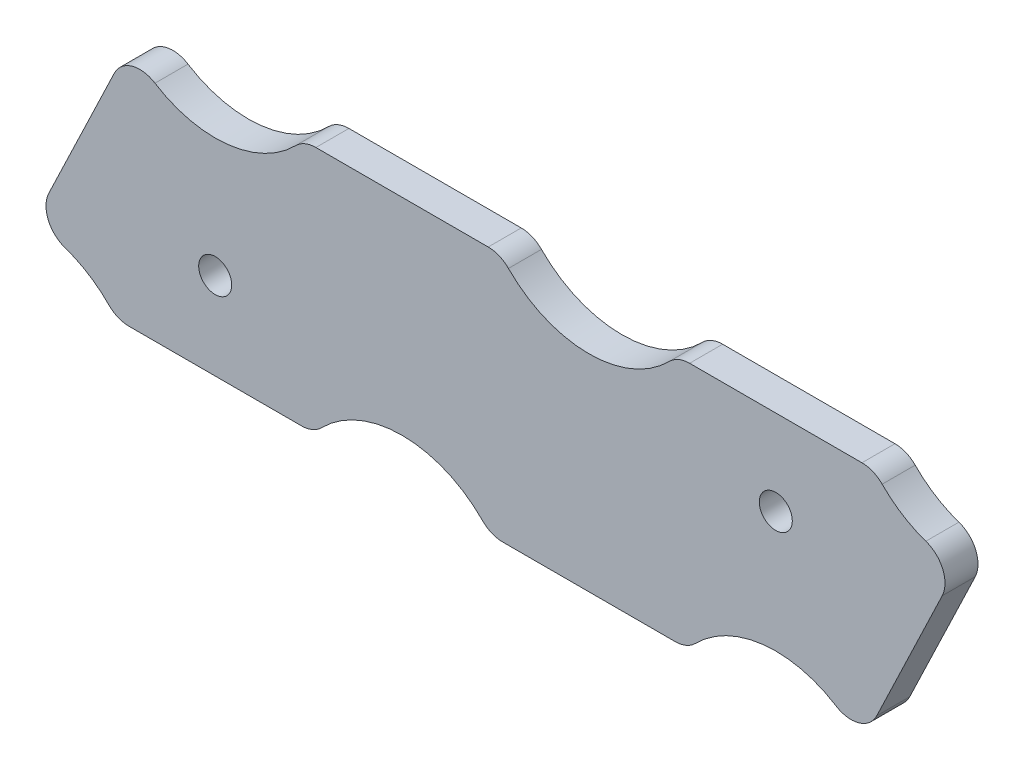
ISO-10303-21;
HEADER;
FILE_DESCRIPTION(('STEP AP214'),'2;1');
FILE_NAME('part.step','',(''),(''),'','','');
FILE_SCHEMA(('AUTOMOTIVE_DESIGN { 1 0 10303 214 1 1 1 1 }'));
ENDSEC;
DATA;
#1=APPLICATION_CONTEXT('core data for automotive mechanical design processes');
#2=APPLICATION_PROTOCOL_DEFINITION('international standard','automotive_design',2000,#1);
#3=PRODUCT_CONTEXT('',#1,'mechanical');
#4=PRODUCT('Part','Part','',(#3));
#5=PRODUCT_RELATED_PRODUCT_CATEGORY('part','',(#4));
#6=PRODUCT_DEFINITION_FORMATION('','',#4);
#7=PRODUCT_DEFINITION_CONTEXT('part definition',#1,'design');
#8=PRODUCT_DEFINITION('design','',#6,#7);
#9=PRODUCT_DEFINITION_SHAPE('','',#8);
#10=(LENGTH_UNIT() NAMED_UNIT(*) SI_UNIT(.MILLI.,.METRE.));
#11=(NAMED_UNIT(*) PLANE_ANGLE_UNIT() SI_UNIT($,.RADIAN.));
#12=(NAMED_UNIT(*) SI_UNIT($,.STERADIAN.) SOLID_ANGLE_UNIT());
#13=UNCERTAINTY_MEASURE_WITH_UNIT(LENGTH_MEASURE(1.E-05),#10,'distance_accuracy_value','');
#14=(GEOMETRIC_REPRESENTATION_CONTEXT(3) GLOBAL_UNCERTAINTY_ASSIGNED_CONTEXT((#13)) GLOBAL_UNIT_ASSIGNED_CONTEXT((#10,
#11,#12)) REPRESENTATION_CONTEXT('',''));
#15=CARTESIAN_POINT('',(0.,0.,0.));
#16=DIRECTION('',(0.,0.,1.));
#17=DIRECTION('',(1.,0.,0.));
#18=AXIS2_PLACEMENT_3D('',#15,#16,#17);
#19=CARTESIAN_POINT('',(0.,0.,2.032));
#20=DIRECTION('',(0.,0.,1.));
#21=DIRECTION('',(1.,0.,0.));
#22=AXIS2_PLACEMENT_3D('',#19,#20,#21);
#23=PLANE('',#22);
#24=CARTESIAN_POINT('',(56.775,25.1695790086618,2.032));
#25=DIRECTION('',(0.,0.,1.));
#26=DIRECTION('',(1.,0.,0.));
#27=AXIS2_PLACEMENT_3D('',#24,#25,#26);
#28=CIRCLE('',#27,1.016);
#29=CARTESIAN_POINT('',(57.7910000000001,25.1695790086618,2.032));
#30=VERTEX_POINT('',#29);
#31=EDGE_CURVE('E447',#30,#30,#28,.T.);
#32=ORIENTED_EDGE('',*,*,#31,.F.);
#33=EDGE_LOOP('',(#32));
#34=FACE_BOUND('',#33,.T.);
#35=CARTESIAN_POINT('',(22.275,20.4920677095079,2.032));
#36=DIRECTION('',(0.,0.,1.));
#37=DIRECTION('',(1.,0.,0.));
#38=AXIS2_PLACEMENT_3D('',#35,#36,#37);
#39=CIRCLE('',#38,1.016);
#40=CARTESIAN_POINT('',(23.291,20.4920677095079,2.032));
#41=VERTEX_POINT('',#40);
#42=EDGE_CURVE('E55',#41,#41,#39,.T.);
#43=ORIENTED_EDGE('',*,*,#42,.F.);
#44=EDGE_LOOP('',(#43));
#45=FACE_BOUND('',#44,.T.);
#46=CARTESIAN_POINT('',(22.275,34.775,2.032));
#47=DIRECTION('',(0.,0.,-1.));
#48=DIRECTION('',(1.,0.,0.));
#49=AXIS2_PLACEMENT_3D('',#46,#47,#48);
#50=CIRCLE('',#49,6.954);
#51=CARTESIAN_POINT('',(27.228374403337,29.8942010878991,2.032));
#52=VERTEX_POINT('',#51);
#53=CARTESIAN_POINT('',(18.5691218534122,28.8907342715813,2.032));
#54=VERTEX_POINT('',#53);
#55=EDGE_CURVE('E398',#52,#54,#50,.T.);
#56=ORIENTED_EDGE('',*,*,#55,.T.);
#57=CARTESIAN_POINT('',(17.6386554680308,27.4133215649636,2.032));
#58=DIRECTION('',(0.,0.,1.));
#59=DIRECTION('',(1.,0.,0.));
#60=AXIS2_PLACEMENT_3D('',#57,#58,#59);
#61=CIRCLE('',#60,1.746);
#62=CARTESIAN_POINT('',(16.0640846818776,28.1678033999954,2.032));
#63=VERTEX_POINT('',#62);
#64=EDGE_CURVE('E293',#54,#63,#61,.T.);
#65=ORIENTED_EDGE('',*,*,#64,.T.);
#66=DIRECTION('',(-0.432120180430553,-0.901816028724632,0.));
#67=VECTOR('',#66,1.);
#68=CARTESIAN_POINT('',(16.0640846818776,28.1678033999954,2.032));
#69=LINE('',#68,#67);
#70=CARTESIAN_POINT('',(12.0331416883667,19.7554006309292,2.032));
#71=VERTEX_POINT('',#70);
#72=EDGE_CURVE('E297',#63,#71,#69,.T.);
#73=ORIENTED_EDGE('',*,*,#72,.T.);
#74=CARTESIAN_POINT('',(13.6077124745199,19.0009187958975,2.032));
#75=DIRECTION('',(0.,0.,1.));
#76=DIRECTION('',(1.,0.,0.));
#77=AXIS2_PLACEMENT_3D('',#74,#75,#76);
#78=CIRCLE('',#77,1.746);
#79=CARTESIAN_POINT('',(13.0392163848059,17.3500619892725,2.032));
#80=VERTEX_POINT('',#79);
#81=EDGE_CURVE('E63',#71,#80,#78,.T.);
#82=ORIENTED_EDGE('',*,*,#81,.T.);
#83=CARTESIAN_POINT('',(10.775,10.775,2.032));
#84=DIRECTION('',(0.,0.,-1.));
#85=DIRECTION('',(1.,0.,0.));
#86=AXIS2_PLACEMENT_3D('',#83,#84,#85);
#87=CIRCLE('',#86,6.954);
#88=CARTESIAN_POINT('',(15.728374403337,15.6557989121009,2.032));
#89=VERTEX_POINT('',#88);
#90=EDGE_CURVE('E216',#80,#89,#87,.T.);
#91=ORIENTED_EDGE('',*,*,#90,.T.);
#92=CARTESIAN_POINT('',(16.9720602975312,16.8812626596603,2.032));
#93=DIRECTION('',(0.,0.,1.));
#94=DIRECTION('',(1.,0.,0.));
#95=AXIS2_PLACEMENT_3D('',#92,#93,#94);
#96=CIRCLE('',#95,1.746);
#97=CARTESIAN_POINT('',(16.9720602975312,15.1352626596603,2.032));
#98=VERTEX_POINT('',#97);
#99=EDGE_CURVE('E312',#89,#98,#96,.T.);
#100=ORIENTED_EDGE('',*,*,#99,.T.);
#101=DIRECTION('',(1.,0.,0.));
#102=VECTOR('',#101,1.);
#103=CARTESIAN_POINT('',(16.9720602975312,15.1352626596603,2.032));
#104=LINE('',#103,#102);
#105=CARTESIAN_POINT('',(27.5779397024688,15.1352626596603,2.032));
#106=VERTEX_POINT('',#105);
#107=EDGE_CURVE('E316',#98,#106,#104,.T.);
#108=ORIENTED_EDGE('',*,*,#107,.T.);
#109=CARTESIAN_POINT('',(27.5779397024688,16.8812626596603,2.032));
#110=DIRECTION('',(0.,0.,1.));
#111=DIRECTION('',(1.,0.,0.));
#112=AXIS2_PLACEMENT_3D('',#109,#110,#111);
#113=CIRCLE('',#112,1.746);
#114=CARTESIAN_POINT('',(28.821625596663,15.6557989121009,2.032));
#115=VERTEX_POINT('',#114);
#116=EDGE_CURVE('E324',#106,#115,#113,.T.);
#117=ORIENTED_EDGE('',*,*,#116,.T.);
#118=CARTESIAN_POINT('',(33.775,10.775,2.032));
#119=DIRECTION('',(0.,0.,-1.));
#120=DIRECTION('',(1.,0.,0.));
#121=AXIS2_PLACEMENT_3D('',#118,#119,#120);
#122=CIRCLE('',#121,6.954);
#123=CARTESIAN_POINT('',(38.728374403337,15.6557989121009,2.032));
#124=VERTEX_POINT('',#123);
#125=EDGE_CURVE('E327',#115,#124,#122,.T.);
#126=ORIENTED_EDGE('',*,*,#125,.T.);
#127=CARTESIAN_POINT('',(39.9720602975312,16.8812626596603,2.032));
#128=DIRECTION('',(0.,0.,1.));
#129=DIRECTION('',(1.,0.,0.));
#130=AXIS2_PLACEMENT_3D('',#127,#128,#129);
#131=CIRCLE('',#130,1.746);
#132=CARTESIAN_POINT('',(39.9720602975312,15.1352626596604,2.032));
#133=VERTEX_POINT('',#132);
#134=EDGE_CURVE('E331',#124,#133,#131,.T.);
#135=ORIENTED_EDGE('',*,*,#134,.T.);
#136=DIRECTION('',(1.,0.,0.));
#137=VECTOR('',#136,1.);
#138=CARTESIAN_POINT('',(39.9720602975312,15.1352626596604,2.032));
#139=LINE('',#138,#137);
#140=CARTESIAN_POINT('',(50.5779397024688,15.1352626596603,2.032));
#141=VERTEX_POINT('',#140);
#142=EDGE_CURVE('E335',#133,#141,#139,.T.);
#143=ORIENTED_EDGE('',*,*,#142,.T.);
#144=CARTESIAN_POINT('',(50.5779397024688,16.8812626596603,2.032));
#145=DIRECTION('',(0.,0.,1.));
#146=DIRECTION('',(1.,0.,0.));
#147=AXIS2_PLACEMENT_3D('',#144,#145,#146);
#148=CIRCLE('',#147,1.746);
#149=CARTESIAN_POINT('',(51.821625596663,15.6557989121009,2.032));
#150=VERTEX_POINT('',#149);
#151=EDGE_CURVE('E343',#141,#150,#148,.T.);
#152=ORIENTED_EDGE('',*,*,#151,.T.);
#153=CARTESIAN_POINT('',(56.775,10.775,2.032));
#154=DIRECTION('',(0.,0.,-1.));
#155=DIRECTION('',(1.,0.,0.));
#156=AXIS2_PLACEMENT_3D('',#153,#154,#155);
#157=CIRCLE('',#156,6.95400000000001);
#158=CARTESIAN_POINT('',(60.4808781465878,16.6592657284187,2.032));
#159=VERTEX_POINT('',#158);
#160=EDGE_CURVE('E346',#150,#159,#157,.T.);
#161=ORIENTED_EDGE('',*,*,#160,.T.);
#162=CARTESIAN_POINT('',(61.4113445319692,18.1366784350364,2.032));
#163=DIRECTION('',(0.,0.,1.));
#164=DIRECTION('',(1.,0.,0.));
#165=AXIS2_PLACEMENT_3D('',#162,#163,#164);
#166=CIRCLE('',#165,1.746);
#167=CARTESIAN_POINT('',(62.9859153181224,17.3821966000046,2.032));
#168=VERTEX_POINT('',#167);
#169=EDGE_CURVE('E350',#159,#168,#166,.T.);
#170=ORIENTED_EDGE('',*,*,#169,.T.);
#171=DIRECTION('',(0.432120180430553,0.901816028724632,0.));
#172=VECTOR('',#171,1.);
#173=CARTESIAN_POINT('',(62.9859153181224,17.3821966000046,2.032));
#174=LINE('',#173,#172);
#175=CARTESIAN_POINT('',(67.0168583116333,25.7945993690708,2.032));
#176=VERTEX_POINT('',#175);
#177=EDGE_CURVE('E354',#168,#176,#174,.T.);
#178=ORIENTED_EDGE('',*,*,#177,.T.);
#179=CARTESIAN_POINT('',(65.4422875254801,26.5490812041025,2.032));
#180=DIRECTION('',(0.,0.,1.));
#181=DIRECTION('',(1.,0.,0.));
#182=AXIS2_PLACEMENT_3D('',#179,#180,#181);
#183=CIRCLE('',#182,1.746);
#184=CARTESIAN_POINT('',(66.0107836151941,28.1999380107275,2.032));
#185=VERTEX_POINT('',#184);
#186=EDGE_CURVE('E362',#176,#185,#183,.T.);
#187=ORIENTED_EDGE('',*,*,#186,.T.);
#188=CARTESIAN_POINT('',(68.275,34.775,2.032));
#189=DIRECTION('',(0.,0.,-1.));
#190=DIRECTION('',(1.,0.,0.));
#191=AXIS2_PLACEMENT_3D('',#188,#189,#190);
#192=CIRCLE('',#191,6.95400000000001);
#193=CARTESIAN_POINT('',(63.3216255966629,29.8942010878991,2.032));
#194=VERTEX_POINT('',#193);
#195=EDGE_CURVE('E365',#185,#194,#192,.T.);
#196=ORIENTED_EDGE('',*,*,#195,.T.);
#197=CARTESIAN_POINT('',(62.0779397024688,28.6687373403397,2.032));
#198=DIRECTION('',(0.,0.,1.));
#199=DIRECTION('',(1.,0.,0.));
#200=AXIS2_PLACEMENT_3D('',#197,#198,#199);
#201=CIRCLE('',#200,1.746);
#202=CARTESIAN_POINT('',(62.0779397024688,30.4147373403397,2.032));
#203=VERTEX_POINT('',#202);
#204=EDGE_CURVE('E369',#194,#203,#201,.T.);
#205=ORIENTED_EDGE('',*,*,#204,.T.);
#206=DIRECTION('',(-1.,0.,0.));
#207=VECTOR('',#206,1.);
#208=CARTESIAN_POINT('',(62.0779397024688,30.4147373403397,2.032));
#209=LINE('',#208,#207);
#210=CARTESIAN_POINT('',(51.4720602975312,30.4147373403397,2.032));
#211=VERTEX_POINT('',#210);
#212=EDGE_CURVE('E373',#203,#211,#209,.T.);
#213=ORIENTED_EDGE('',*,*,#212,.T.);
#214=CARTESIAN_POINT('',(51.4720602975312,28.6687373403397,2.032));
#215=DIRECTION('',(0.,0.,1.));
#216=DIRECTION('',(1.,0.,0.));
#217=AXIS2_PLACEMENT_3D('',#214,#215,#216);
#218=CIRCLE('',#217,1.746);
#219=CARTESIAN_POINT('',(50.228374403337,29.8942010878991,2.032));
#220=VERTEX_POINT('',#219);
#221=EDGE_CURVE('E381',#211,#220,#218,.T.);
#222=ORIENTED_EDGE('',*,*,#221,.T.);
#223=CARTESIAN_POINT('',(45.275,34.775,2.032));
#224=DIRECTION('',(0.,0.,-1.));
#225=DIRECTION('',(1.,0.,0.));
#226=AXIS2_PLACEMENT_3D('',#223,#224,#225);
#227=CIRCLE('',#226,6.954);
#228=CARTESIAN_POINT('',(40.321625596663,29.8942010878991,2.032));
#229=VERTEX_POINT('',#228);
#230=EDGE_CURVE('E384',#220,#229,#227,.T.);
#231=ORIENTED_EDGE('',*,*,#230,.T.);
#232=CARTESIAN_POINT('',(39.0779397024688,28.6687373403397,2.032));
#233=DIRECTION('',(0.,0.,1.));
#234=DIRECTION('',(1.,0.,0.));
#235=AXIS2_PLACEMENT_3D('',#232,#233,#234);
#236=CIRCLE('',#235,1.746);
#237=CARTESIAN_POINT('',(39.0779397024688,30.4147373403397,2.032));
#238=VERTEX_POINT('',#237);
#239=EDGE_CURVE('E388',#229,#238,#236,.T.);
#240=ORIENTED_EDGE('',*,*,#239,.T.);
#241=DIRECTION('',(-1.,0.,0.));
#242=VECTOR('',#241,1.);
#243=CARTESIAN_POINT('',(39.0779397024688,30.4147373403397,2.032));
#244=LINE('',#243,#242);
#245=CARTESIAN_POINT('',(28.4720602975312,30.4147373403397,2.032));
#246=VERTEX_POINT('',#245);
#247=EDGE_CURVE('E392',#238,#246,#244,.T.);
#248=ORIENTED_EDGE('',*,*,#247,.T.);
#249=CARTESIAN_POINT('',(28.4720602975312,28.6687373403397,2.032));
#250=DIRECTION('',(0.,0.,1.));
#251=DIRECTION('',(1.,0.,0.));
#252=AXIS2_PLACEMENT_3D('',#249,#250,#251);
#253=CIRCLE('',#252,1.746);
#254=EDGE_CURVE('E395',#246,#52,#253,.T.);
#255=ORIENTED_EDGE('',*,*,#254,.T.);
#256=EDGE_LOOP('',(#56,#65,#73,#82,#91,#100,#108,#117,#126,#135,#143,#152,#161,#170,#178,#187,
#196,#205,#213,#222,#231,#240,#248,#255));
#257=FACE_BOUND('',#256,.T.);
#258=ADVANCED_FACE('F46',(#34,#45,#257),#23,.T.);
#259=CARTESIAN_POINT('',(0.,0.,0.));
#260=DIRECTION('',(0.,0.,1.));
#261=DIRECTION('',(1.,0.,0.));
#262=AXIS2_PLACEMENT_3D('',#259,#260,#261);
#263=PLANE('',#262);
#264=CARTESIAN_POINT('',(56.775,25.1695790086618,0.));
#265=DIRECTION('',(0.,0.,1.));
#266=DIRECTION('',(1.,0.,0.));
#267=AXIS2_PLACEMENT_3D('',#264,#265,#266);
#268=CIRCLE('',#267,1.016);
#269=CARTESIAN_POINT('',(57.7910000000001,25.1695790086618,0.));
#270=VERTEX_POINT('',#269);
#271=EDGE_CURVE('E50',#270,#270,#268,.T.);
#272=ORIENTED_EDGE('',*,*,#271,.T.);
#273=EDGE_LOOP('',(#272));
#274=FACE_BOUND('',#273,.T.);
#275=CARTESIAN_POINT('',(22.275,20.4920677095079,0.));
#276=DIRECTION('',(0.,0.,1.));
#277=DIRECTION('',(1.,0.,0.));
#278=AXIS2_PLACEMENT_3D('',#275,#276,#277);
#279=CIRCLE('',#278,1.016);
#280=CARTESIAN_POINT('',(23.291,20.4920677095079,0.));
#281=VERTEX_POINT('',#280);
#282=EDGE_CURVE('E12',#281,#281,#279,.T.);
#283=ORIENTED_EDGE('',*,*,#282,.T.);
#284=EDGE_LOOP('',(#283));
#285=FACE_BOUND('',#284,.T.);
#286=CARTESIAN_POINT('',(17.6386554680308,27.4133215649636,0.));
#287=DIRECTION('',(0.,0.,1.));
#288=DIRECTION('',(1.,0.,0.));
#289=AXIS2_PLACEMENT_3D('',#286,#287,#288);
#290=CIRCLE('',#289,1.746);
#291=CARTESIAN_POINT('',(18.5691218534122,28.8907342715813,0.));
#292=VERTEX_POINT('',#291);
#293=CARTESIAN_POINT('',(16.0640846818776,28.1678033999954,0.));
#294=VERTEX_POINT('',#293);
#295=EDGE_CURVE('E71',#292,#294,#290,.T.);
#296=ORIENTED_EDGE('',*,*,#295,.F.);
#297=CARTESIAN_POINT('',(22.275,34.775,0.));
#298=DIRECTION('',(0.,0.,-1.));
#299=DIRECTION('',(1.,0.,0.));
#300=AXIS2_PLACEMENT_3D('',#297,#298,#299);
#301=CIRCLE('',#300,6.954);
#302=CARTESIAN_POINT('',(27.228374403337,29.8942010878991,0.));
#303=VERTEX_POINT('',#302);
#304=EDGE_CURVE('E289',#303,#292,#301,.T.);
#305=ORIENTED_EDGE('',*,*,#304,.F.);
#306=CARTESIAN_POINT('',(28.4720602975312,28.6687373403397,0.));
#307=DIRECTION('',(0.,0.,1.));
#308=DIRECTION('',(1.,0.,0.));
#309=AXIS2_PLACEMENT_3D('',#306,#307,#308);
#310=CIRCLE('',#309,1.746);
#311=CARTESIAN_POINT('',(28.4720602975312,30.4147373403397,0.));
#312=VERTEX_POINT('',#311);
#313=EDGE_CURVE('E286',#312,#303,#310,.T.);
#314=ORIENTED_EDGE('',*,*,#313,.F.);
#315=DIRECTION('',(-1.,0.,0.));
#316=VECTOR('',#315,1.);
#317=CARTESIAN_POINT('',(39.0779397024688,30.4147373403397,0.));
#318=LINE('',#317,#316);
#319=CARTESIAN_POINT('',(39.0779397024688,30.4147373403397,0.));
#320=VERTEX_POINT('',#319);
#321=EDGE_CURVE('E283',#320,#312,#318,.T.);
#322=ORIENTED_EDGE('',*,*,#321,.F.);
#323=CARTESIAN_POINT('',(39.0779397024688,28.6687373403397,0.));
#324=DIRECTION('',(0.,0.,1.));
#325=DIRECTION('',(1.,0.,0.));
#326=AXIS2_PLACEMENT_3D('',#323,#324,#325);
#327=CIRCLE('',#326,1.746);
#328=CARTESIAN_POINT('',(40.321625596663,29.8942010878991,0.));
#329=VERTEX_POINT('',#328);
#330=EDGE_CURVE('E280',#329,#320,#327,.T.);
#331=ORIENTED_EDGE('',*,*,#330,.F.);
#332=CARTESIAN_POINT('',(45.275,34.775,0.));
#333=DIRECTION('',(0.,0.,-1.));
#334=DIRECTION('',(1.,0.,0.));
#335=AXIS2_PLACEMENT_3D('',#332,#333,#334);
#336=CIRCLE('',#335,6.954);
#337=CARTESIAN_POINT('',(50.228374403337,29.8942010878991,0.));
#338=VERTEX_POINT('',#337);
#339=EDGE_CURVE('E277',#338,#329,#336,.T.);
#340=ORIENTED_EDGE('',*,*,#339,.F.);
#341=CARTESIAN_POINT('',(51.4720602975312,28.6687373403397,0.));
#342=DIRECTION('',(0.,0.,1.));
#343=DIRECTION('',(1.,0.,0.));
#344=AXIS2_PLACEMENT_3D('',#341,#342,#343);
#345=CIRCLE('',#344,1.746);
#346=CARTESIAN_POINT('',(51.4720602975312,30.4147373403397,0.));
#347=VERTEX_POINT('',#346);
#348=EDGE_CURVE('E274',#347,#338,#345,.T.);
#349=ORIENTED_EDGE('',*,*,#348,.F.);
#350=DIRECTION('',(-1.,0.,0.));
#351=VECTOR('',#350,1.);
#352=CARTESIAN_POINT('',(62.0779397024688,30.4147373403397,0.));
#353=LINE('',#352,#351);
#354=CARTESIAN_POINT('',(62.0779397024688,30.4147373403397,0.));
#355=VERTEX_POINT('',#354);
#356=EDGE_CURVE('E271',#355,#347,#353,.T.);
#357=ORIENTED_EDGE('',*,*,#356,.F.);
#358=CARTESIAN_POINT('',(62.0779397024688,28.6687373403397,0.));
#359=DIRECTION('',(0.,0.,1.));
#360=DIRECTION('',(1.,0.,0.));
#361=AXIS2_PLACEMENT_3D('',#358,#359,#360);
#362=CIRCLE('',#361,1.746);
#363=CARTESIAN_POINT('',(63.3216255966629,29.8942010878991,0.));
#364=VERTEX_POINT('',#363);
#365=EDGE_CURVE('E268',#364,#355,#362,.T.);
#366=ORIENTED_EDGE('',*,*,#365,.F.);
#367=CARTESIAN_POINT('',(68.275,34.775,0.));
#368=DIRECTION('',(0.,0.,-1.));
#369=DIRECTION('',(1.,0.,0.));
#370=AXIS2_PLACEMENT_3D('',#367,#368,#369);
#371=CIRCLE('',#370,6.95400000000001);
#372=CARTESIAN_POINT('',(66.0107836151941,28.1999380107275,0.));
#373=VERTEX_POINT('',#372);
#374=EDGE_CURVE('E265',#373,#364,#371,.T.);
#375=ORIENTED_EDGE('',*,*,#374,.F.);
#376=CARTESIAN_POINT('',(65.4422875254801,26.5490812041025,0.));
#377=DIRECTION('',(0.,0.,1.));
#378=DIRECTION('',(1.,0.,0.));
#379=AXIS2_PLACEMENT_3D('',#376,#377,#378);
#380=CIRCLE('',#379,1.746);
#381=CARTESIAN_POINT('',(67.0168583116333,25.7945993690708,0.));
#382=VERTEX_POINT('',#381);
#383=EDGE_CURVE('E262',#382,#373,#380,.T.);
#384=ORIENTED_EDGE('',*,*,#383,.F.);
#385=DIRECTION('',(0.432120180430553,0.901816028724632,0.));
#386=VECTOR('',#385,1.);
#387=CARTESIAN_POINT('',(62.9859153181224,17.3821966000046,0.));
#388=LINE('',#387,#386);
#389=CARTESIAN_POINT('',(62.9859153181224,17.3821966000046,0.));
#390=VERTEX_POINT('',#389);
#391=EDGE_CURVE('E259',#390,#382,#388,.T.);
#392=ORIENTED_EDGE('',*,*,#391,.F.);
#393=CARTESIAN_POINT('',(61.4113445319692,18.1366784350364,0.));
#394=DIRECTION('',(0.,0.,1.));
#395=DIRECTION('',(1.,0.,0.));
#396=AXIS2_PLACEMENT_3D('',#393,#394,#395);
#397=CIRCLE('',#396,1.746);
#398=CARTESIAN_POINT('',(60.4808781465878,16.6592657284187,0.));
#399=VERTEX_POINT('',#398);
#400=EDGE_CURVE('E256',#399,#390,#397,.T.);
#401=ORIENTED_EDGE('',*,*,#400,.F.);
#402=CARTESIAN_POINT('',(56.775,10.775,0.));
#403=DIRECTION('',(0.,0.,-1.));
#404=DIRECTION('',(1.,0.,0.));
#405=AXIS2_PLACEMENT_3D('',#402,#403,#404);
#406=CIRCLE('',#405,6.95400000000001);
#407=CARTESIAN_POINT('',(51.821625596663,15.6557989121009,0.));
#408=VERTEX_POINT('',#407);
#409=EDGE_CURVE('E253',#408,#399,#406,.T.);
#410=ORIENTED_EDGE('',*,*,#409,.F.);
#411=CARTESIAN_POINT('',(50.5779397024688,16.8812626596603,0.));
#412=DIRECTION('',(0.,0.,1.));
#413=DIRECTION('',(1.,0.,0.));
#414=AXIS2_PLACEMENT_3D('',#411,#412,#413);
#415=CIRCLE('',#414,1.746);
#416=CARTESIAN_POINT('',(50.5779397024688,15.1352626596603,0.));
#417=VERTEX_POINT('',#416);
#418=EDGE_CURVE('E250',#417,#408,#415,.T.);
#419=ORIENTED_EDGE('',*,*,#418,.F.);
#420=DIRECTION('',(1.,0.,0.));
#421=VECTOR('',#420,1.);
#422=CARTESIAN_POINT('',(39.9720602975312,15.1352626596604,0.));
#423=LINE('',#422,#421);
#424=CARTESIAN_POINT('',(39.9720602975312,15.1352626596604,0.));
#425=VERTEX_POINT('',#424);
#426=EDGE_CURVE('E247',#425,#417,#423,.T.);
#427=ORIENTED_EDGE('',*,*,#426,.F.);
#428=CARTESIAN_POINT('',(39.9720602975312,16.8812626596603,0.));
#429=DIRECTION('',(0.,0.,1.));
#430=DIRECTION('',(1.,0.,0.));
#431=AXIS2_PLACEMENT_3D('',#428,#429,#430);
#432=CIRCLE('',#431,1.746);
#433=CARTESIAN_POINT('',(38.728374403337,15.6557989121009,0.));
#434=VERTEX_POINT('',#433);
#435=EDGE_CURVE('E244',#434,#425,#432,.T.);
#436=ORIENTED_EDGE('',*,*,#435,.F.);
#437=CARTESIAN_POINT('',(33.775,10.775,0.));
#438=DIRECTION('',(0.,0.,-1.));
#439=DIRECTION('',(1.,0.,0.));
#440=AXIS2_PLACEMENT_3D('',#437,#438,#439);
#441=CIRCLE('',#440,6.954);
#442=CARTESIAN_POINT('',(28.821625596663,15.6557989121009,0.));
#443=VERTEX_POINT('',#442);
#444=EDGE_CURVE('E241',#443,#434,#441,.T.);
#445=ORIENTED_EDGE('',*,*,#444,.F.);
#446=CARTESIAN_POINT('',(27.5779397024688,16.8812626596603,0.));
#447=DIRECTION('',(0.,0.,1.));
#448=DIRECTION('',(1.,0.,0.));
#449=AXIS2_PLACEMENT_3D('',#446,#447,#448);
#450=CIRCLE('',#449,1.746);
#451=CARTESIAN_POINT('',(27.5779397024688,15.1352626596603,0.));
#452=VERTEX_POINT('',#451);
#453=EDGE_CURVE('E238',#452,#443,#450,.T.);
#454=ORIENTED_EDGE('',*,*,#453,.F.);
#455=DIRECTION('',(1.,0.,0.));
#456=VECTOR('',#455,1.);
#457=CARTESIAN_POINT('',(16.9720602975312,15.1352626596603,0.));
#458=LINE('',#457,#456);
#459=CARTESIAN_POINT('',(16.9720602975312,15.1352626596603,0.));
#460=VERTEX_POINT('',#459);
#461=EDGE_CURVE('E232',#460,#452,#458,.T.);
#462=ORIENTED_EDGE('',*,*,#461,.F.);
#463=CARTESIAN_POINT('',(16.9720602975312,16.8812626596603,0.));
#464=DIRECTION('',(0.,0.,1.));
#465=DIRECTION('',(1.,0.,0.));
#466=AXIS2_PLACEMENT_3D('',#463,#464,#465);
#467=CIRCLE('',#466,1.746);
#468=CARTESIAN_POINT('',(15.728374403337,15.6557989121009,0.));
#469=VERTEX_POINT('',#468);
#470=EDGE_CURVE('E230',#469,#460,#467,.T.);
#471=ORIENTED_EDGE('',*,*,#470,.F.);
#472=CARTESIAN_POINT('',(10.775,10.775,0.));
#473=DIRECTION('',(0.,0.,-1.));
#474=DIRECTION('',(1.,0.,0.));
#475=AXIS2_PLACEMENT_3D('',#472,#473,#474);
#476=CIRCLE('',#475,6.954);
#477=CARTESIAN_POINT('',(13.0392163848059,17.3500619892725,0.));
#478=VERTEX_POINT('',#477);
#479=EDGE_CURVE('E213',#478,#469,#476,.T.);
#480=ORIENTED_EDGE('',*,*,#479,.F.);
#481=CARTESIAN_POINT('',(13.6077124745199,19.0009187958975,0.));
#482=DIRECTION('',(0.,0.,1.));
#483=DIRECTION('',(1.,0.,0.));
#484=AXIS2_PLACEMENT_3D('',#481,#482,#483);
#485=CIRCLE('',#484,1.746);
#486=CARTESIAN_POINT('',(12.0331416883667,19.7554006309292,0.));
#487=VERTEX_POINT('',#486);
#488=EDGE_CURVE('E221',#487,#478,#485,.T.);
#489=ORIENTED_EDGE('',*,*,#488,.F.);
#490=DIRECTION('',(-0.432120180430553,-0.901816028724632,0.));
#491=VECTOR('',#490,1.);
#492=CARTESIAN_POINT('',(16.0640846818776,28.1678033999954,0.));
#493=LINE('',#492,#491);
#494=EDGE_CURVE('E226',#294,#487,#493,.T.);
#495=ORIENTED_EDGE('',*,*,#494,.F.);
#496=EDGE_LOOP('',(#296,#305,#314,#322,#331,#340,#349,#357,#366,#375,#384,#392,#401,#410,#419,
#427,#436,#445,#454,#462,#471,#480,#489,#495));
#497=FACE_BOUND('',#496,.T.);
#498=ADVANCED_FACE('F48',(#274,#285,#497),#263,.F.);
#499=CARTESIAN_POINT('',(56.775,25.1695790086618,0.));
#500=DIRECTION('',(0.,0.,1.));
#501=DIRECTION('',(1.,0.,0.));
#502=AXIS2_PLACEMENT_3D('',#499,#500,#501);
#503=CYLINDRICAL_SURFACE('',#502,1.016);
#504=ORIENTED_EDGE('',*,*,#271,.F.);
#505=EDGE_LOOP('',(#504));
#506=FACE_BOUND('',#505,.T.);
#507=ORIENTED_EDGE('',*,*,#31,.T.);
#508=EDGE_LOOP('',(#507));
#509=FACE_BOUND('',#508,.T.);
#510=ADVANCED_FACE('F458',(#506,#509),#503,.F.);
#511=CARTESIAN_POINT('',(22.275,20.4920677095079,0.));
#512=DIRECTION('',(0.,0.,1.));
#513=DIRECTION('',(1.,0.,0.));
#514=AXIS2_PLACEMENT_3D('',#511,#512,#513);
#515=CYLINDRICAL_SURFACE('',#514,1.016);
#516=ORIENTED_EDGE('',*,*,#282,.F.);
#517=EDGE_LOOP('',(#516));
#518=FACE_BOUND('',#517,.T.);
#519=ORIENTED_EDGE('',*,*,#42,.T.);
#520=EDGE_LOOP('',(#519));
#521=FACE_BOUND('',#520,.T.);
#522=ADVANCED_FACE('F460',(#518,#521),#515,.F.);
#523=CARTESIAN_POINT('',(17.6386554680308,27.4133215649636,0.));
#524=DIRECTION('',(0.,0.,1.));
#525=DIRECTION('',(1.,0.,0.));
#526=AXIS2_PLACEMENT_3D('',#523,#524,#525);
#527=CYLINDRICAL_SURFACE('',#526,1.746);
#528=ORIENTED_EDGE('',*,*,#64,.F.);
#529=DIRECTION('',(0.,0.,1.));
#530=VECTOR('',#529,1.);
#531=CARTESIAN_POINT('',(18.5691218534122,28.8907342715813,0.));
#532=LINE('',#531,#530);
#533=EDGE_CURVE('E402',#292,#54,#532,.T.);
#534=ORIENTED_EDGE('',*,*,#533,.F.);
#535=ORIENTED_EDGE('',*,*,#295,.T.);
#536=DIRECTION('',(0.,0.,1.));
#537=VECTOR('',#536,1.);
#538=CARTESIAN_POINT('',(16.0640846818776,28.1678033999954,0.));
#539=LINE('',#538,#537);
#540=EDGE_CURVE('E292',#294,#63,#539,.T.);
#541=ORIENTED_EDGE('',*,*,#540,.T.);
#542=EDGE_LOOP('',(#528,#534,#535,#541));
#543=FACE_BOUND('',#542,.T.);
#544=ADVANCED_FACE('F465',(#543),#527,.T.);
#545=CARTESIAN_POINT('',(22.275,34.775,0.));
#546=DIRECTION('',(0.,0.,1.));
#547=DIRECTION('',(1.,0.,0.));
#548=AXIS2_PLACEMENT_3D('',#545,#546,#547);
#549=CYLINDRICAL_SURFACE('',#548,6.954);
#550=ORIENTED_EDGE('',*,*,#55,.F.);
#551=DIRECTION('',(0.,0.,1.));
#552=VECTOR('',#551,1.);
#553=CARTESIAN_POINT('',(27.228374403337,29.8942010878991,0.));
#554=LINE('',#553,#552);
#555=EDGE_CURVE('E404',#303,#52,#554,.T.);
#556=ORIENTED_EDGE('',*,*,#555,.F.);
#557=ORIENTED_EDGE('',*,*,#304,.T.);
#558=ORIENTED_EDGE('',*,*,#533,.T.);
#559=EDGE_LOOP('',(#550,#556,#557,#558));
#560=FACE_BOUND('',#559,.T.);
#561=ADVANCED_FACE('F481',(#560),#549,.F.);
#562=CARTESIAN_POINT('',(28.4720602975312,28.6687373403397,0.));
#563=DIRECTION('',(0.,0.,1.));
#564=DIRECTION('',(1.,0.,0.));
#565=AXIS2_PLACEMENT_3D('',#562,#563,#564);
#566=CYLINDRICAL_SURFACE('',#565,1.746);
#567=ORIENTED_EDGE('',*,*,#254,.F.);
#568=DIRECTION('',(0.,0.,1.));
#569=VECTOR('',#568,1.);
#570=CARTESIAN_POINT('',(28.4720602975312,30.4147373403397,0.));
#571=LINE('',#570,#569);
#572=EDGE_CURVE('E406',#312,#246,#571,.T.);
#573=ORIENTED_EDGE('',*,*,#572,.F.);
#574=ORIENTED_EDGE('',*,*,#313,.T.);
#575=ORIENTED_EDGE('',*,*,#555,.T.);
#576=EDGE_LOOP('',(#567,#573,#574,#575));
#577=FACE_BOUND('',#576,.T.);
#578=ADVANCED_FACE('F562',(#577),#566,.T.);
#579=CARTESIAN_POINT('',(39.0779397024688,30.4147373403397,0.));
#580=DIRECTION('',(0.,1.,0.));
#581=DIRECTION('',(-1.,0.,0.));
#582=AXIS2_PLACEMENT_3D('',#579,#580,#581);
#583=PLANE('',#582);
#584=ORIENTED_EDGE('',*,*,#247,.F.);
#585=DIRECTION('',(0.,0.,1.));
#586=VECTOR('',#585,1.);
#587=CARTESIAN_POINT('',(39.0779397024688,30.4147373403397,0.));
#588=LINE('',#587,#586);
#589=EDGE_CURVE('E408',#320,#238,#588,.T.);
#590=ORIENTED_EDGE('',*,*,#589,.F.);
#591=ORIENTED_EDGE('',*,*,#321,.T.);
#592=ORIENTED_EDGE('',*,*,#572,.T.);
#593=EDGE_LOOP('',(#584,#590,#591,#592));
#594=FACE_BOUND('',#593,.T.);
#595=ADVANCED_FACE('F559',(#594),#583,.T.);
#596=CARTESIAN_POINT('',(39.0779397024688,28.6687373403397,0.));
#597=DIRECTION('',(0.,0.,1.));
#598=DIRECTION('',(1.,0.,0.));
#599=AXIS2_PLACEMENT_3D('',#596,#597,#598);
#600=CYLINDRICAL_SURFACE('',#599,1.746);
#601=ORIENTED_EDGE('',*,*,#239,.F.);
#602=DIRECTION('',(0.,0.,1.));
#603=VECTOR('',#602,1.);
#604=CARTESIAN_POINT('',(40.321625596663,29.8942010878991,0.));
#605=LINE('',#604,#603);
#606=EDGE_CURVE('E410',#329,#229,#605,.T.);
#607=ORIENTED_EDGE('',*,*,#606,.F.);
#608=ORIENTED_EDGE('',*,*,#330,.T.);
#609=ORIENTED_EDGE('',*,*,#589,.T.);
#610=EDGE_LOOP('',(#601,#607,#608,#609));
#611=FACE_BOUND('',#610,.T.);
#612=ADVANCED_FACE('F555',(#611),#600,.T.);
#613=CARTESIAN_POINT('',(45.275,34.775,0.));
#614=DIRECTION('',(0.,0.,1.));
#615=DIRECTION('',(1.,0.,0.));
#616=AXIS2_PLACEMENT_3D('',#613,#614,#615);
#617=CYLINDRICAL_SURFACE('',#616,6.954);
#618=ORIENTED_EDGE('',*,*,#230,.F.);
#619=DIRECTION('',(0.,0.,1.));
#620=VECTOR('',#619,1.);
#621=CARTESIAN_POINT('',(50.228374403337,29.8942010878991,0.));
#622=LINE('',#621,#620);
#623=EDGE_CURVE('E412',#338,#220,#622,.T.);
#624=ORIENTED_EDGE('',*,*,#623,.F.);
#625=ORIENTED_EDGE('',*,*,#339,.T.);
#626=ORIENTED_EDGE('',*,*,#606,.T.);
#627=EDGE_LOOP('',(#618,#624,#625,#626));
#628=FACE_BOUND('',#627,.T.);
#629=ADVANCED_FACE('F551',(#628),#617,.F.);
#630=CARTESIAN_POINT('',(51.4720602975312,28.6687373403397,0.));
#631=DIRECTION('',(0.,0.,1.));
#632=DIRECTION('',(1.,0.,0.));
#633=AXIS2_PLACEMENT_3D('',#630,#631,#632);
#634=CYLINDRICAL_SURFACE('',#633,1.746);
#635=ORIENTED_EDGE('',*,*,#221,.F.);
#636=DIRECTION('',(0.,0.,1.));
#637=VECTOR('',#636,1.);
#638=CARTESIAN_POINT('',(51.4720602975312,30.4147373403397,0.));
#639=LINE('',#638,#637);
#640=EDGE_CURVE('E414',#347,#211,#639,.T.);
#641=ORIENTED_EDGE('',*,*,#640,.F.);
#642=ORIENTED_EDGE('',*,*,#348,.T.);
#643=ORIENTED_EDGE('',*,*,#623,.T.);
#644=EDGE_LOOP('',(#635,#641,#642,#643));
#645=FACE_BOUND('',#644,.T.);
#646=ADVANCED_FACE('F547',(#645),#634,.T.);
#647=CARTESIAN_POINT('',(62.0779397024688,30.4147373403397,0.));
#648=DIRECTION('',(0.,1.,0.));
#649=DIRECTION('',(-1.,0.,0.));
#650=AXIS2_PLACEMENT_3D('',#647,#648,#649);
#651=PLANE('',#650);
#652=ORIENTED_EDGE('',*,*,#212,.F.);
#653=DIRECTION('',(0.,0.,1.));
#654=VECTOR('',#653,1.);
#655=CARTESIAN_POINT('',(62.0779397024688,30.4147373403397,0.));
#656=LINE('',#655,#654);
#657=EDGE_CURVE('E416',#355,#203,#656,.T.);
#658=ORIENTED_EDGE('',*,*,#657,.F.);
#659=ORIENTED_EDGE('',*,*,#356,.T.);
#660=ORIENTED_EDGE('',*,*,#640,.T.);
#661=EDGE_LOOP('',(#652,#658,#659,#660));
#662=FACE_BOUND('',#661,.T.);
#663=ADVANCED_FACE('F543',(#662),#651,.T.);
#664=CARTESIAN_POINT('',(62.0779397024688,28.6687373403397,0.));
#665=DIRECTION('',(0.,0.,1.));
#666=DIRECTION('',(1.,0.,0.));
#667=AXIS2_PLACEMENT_3D('',#664,#665,#666);
#668=CYLINDRICAL_SURFACE('',#667,1.746);
#669=ORIENTED_EDGE('',*,*,#204,.F.);
#670=DIRECTION('',(0.,0.,1.));
#671=VECTOR('',#670,1.);
#672=CARTESIAN_POINT('',(63.3216255966629,29.8942010878991,0.));
#673=LINE('',#672,#671);
#674=EDGE_CURVE('E418',#364,#194,#673,.T.);
#675=ORIENTED_EDGE('',*,*,#674,.F.);
#676=ORIENTED_EDGE('',*,*,#365,.T.);
#677=ORIENTED_EDGE('',*,*,#657,.T.);
#678=EDGE_LOOP('',(#669,#675,#676,#677));
#679=FACE_BOUND('',#678,.T.);
#680=ADVANCED_FACE('F539',(#679),#668,.T.);
#681=CARTESIAN_POINT('',(68.275,34.775,0.));
#682=DIRECTION('',(0.,0.,1.));
#683=DIRECTION('',(1.,0.,0.));
#684=AXIS2_PLACEMENT_3D('',#681,#682,#683);
#685=CYLINDRICAL_SURFACE('',#684,6.95400000000001);
#686=ORIENTED_EDGE('',*,*,#195,.F.);
#687=DIRECTION('',(0.,0.,1.));
#688=VECTOR('',#687,1.);
#689=CARTESIAN_POINT('',(66.0107836151941,28.1999380107275,0.));
#690=LINE('',#689,#688);
#691=EDGE_CURVE('E420',#373,#185,#690,.T.);
#692=ORIENTED_EDGE('',*,*,#691,.F.);
#693=ORIENTED_EDGE('',*,*,#374,.T.);
#694=ORIENTED_EDGE('',*,*,#674,.T.);
#695=EDGE_LOOP('',(#686,#692,#693,#694));
#696=FACE_BOUND('',#695,.T.);
#697=ADVANCED_FACE('F534',(#696),#685,.F.);
#698=CARTESIAN_POINT('',(65.4422875254801,26.5490812041025,0.));
#699=DIRECTION('',(0.,0.,1.));
#700=DIRECTION('',(1.,0.,0.));
#701=AXIS2_PLACEMENT_3D('',#698,#699,#700);
#702=CYLINDRICAL_SURFACE('',#701,1.746);
#703=ORIENTED_EDGE('',*,*,#186,.F.);
#704=DIRECTION('',(0.,0.,1.));
#705=VECTOR('',#704,1.);
#706=CARTESIAN_POINT('',(67.0168583116333,25.7945993690708,0.));
#707=LINE('',#706,#705);
#708=EDGE_CURVE('E422',#382,#176,#707,.T.);
#709=ORIENTED_EDGE('',*,*,#708,.F.);
#710=ORIENTED_EDGE('',*,*,#383,.T.);
#711=ORIENTED_EDGE('',*,*,#691,.T.);
#712=EDGE_LOOP('',(#703,#709,#710,#711));
#713=FACE_BOUND('',#712,.T.);
#714=ADVANCED_FACE('F530',(#713),#702,.T.);
#715=CARTESIAN_POINT('',(62.9859153181224,17.3821966000046,0.));
#716=DIRECTION('',(0.901816028724632,-0.432120180430553,0.));
#717=DIRECTION('',(0.432120180430553,0.901816028724632,0.));
#718=AXIS2_PLACEMENT_3D('',#715,#716,#717);
#719=PLANE('',#718);
#720=ORIENTED_EDGE('',*,*,#177,.F.);
#721=DIRECTION('',(0.,0.,1.));
#722=VECTOR('',#721,1.);
#723=CARTESIAN_POINT('',(62.9859153181224,17.3821966000046,0.));
#724=LINE('',#723,#722);
#725=EDGE_CURVE('E424',#390,#168,#724,.T.);
#726=ORIENTED_EDGE('',*,*,#725,.F.);
#727=ORIENTED_EDGE('',*,*,#391,.T.);
#728=ORIENTED_EDGE('',*,*,#708,.T.);
#729=EDGE_LOOP('',(#720,#726,#727,#728));
#730=FACE_BOUND('',#729,.T.);
#731=ADVANCED_FACE('F526',(#730),#719,.T.);
#732=CARTESIAN_POINT('',(61.4113445319692,18.1366784350364,0.));
#733=DIRECTION('',(0.,0.,1.));
#734=DIRECTION('',(1.,0.,0.));
#735=AXIS2_PLACEMENT_3D('',#732,#733,#734);
#736=CYLINDRICAL_SURFACE('',#735,1.746);
#737=ORIENTED_EDGE('',*,*,#169,.F.);
#738=DIRECTION('',(0.,0.,1.));
#739=VECTOR('',#738,1.);
#740=CARTESIAN_POINT('',(60.4808781465878,16.6592657284187,0.));
#741=LINE('',#740,#739);
#742=EDGE_CURVE('E426',#399,#159,#741,.T.);
#743=ORIENTED_EDGE('',*,*,#742,.F.);
#744=ORIENTED_EDGE('',*,*,#400,.T.);
#745=ORIENTED_EDGE('',*,*,#725,.T.);
#746=EDGE_LOOP('',(#737,#743,#744,#745));
#747=FACE_BOUND('',#746,.T.);
#748=ADVANCED_FACE('F521',(#747),#736,.T.);
#749=CARTESIAN_POINT('',(56.775,10.775,0.));
#750=DIRECTION('',(0.,0.,1.));
#751=DIRECTION('',(1.,0.,0.));
#752=AXIS2_PLACEMENT_3D('',#749,#750,#751);
#753=CYLINDRICAL_SURFACE('',#752,6.95400000000001);
#754=ORIENTED_EDGE('',*,*,#160,.F.);
#755=DIRECTION('',(0.,0.,1.));
#756=VECTOR('',#755,1.);
#757=CARTESIAN_POINT('',(51.821625596663,15.6557989121009,0.));
#758=LINE('',#757,#756);
#759=EDGE_CURVE('E428',#408,#150,#758,.T.);
#760=ORIENTED_EDGE('',*,*,#759,.F.);
#761=ORIENTED_EDGE('',*,*,#409,.T.);
#762=ORIENTED_EDGE('',*,*,#742,.T.);
#763=EDGE_LOOP('',(#754,#760,#761,#762));
#764=FACE_BOUND('',#763,.T.);
#765=ADVANCED_FACE('F517',(#764),#753,.F.);
#766=CARTESIAN_POINT('',(50.5779397024688,16.8812626596603,0.));
#767=DIRECTION('',(0.,0.,1.));
#768=DIRECTION('',(1.,0.,0.));
#769=AXIS2_PLACEMENT_3D('',#766,#767,#768);
#770=CYLINDRICAL_SURFACE('',#769,1.746);
#771=ORIENTED_EDGE('',*,*,#151,.F.);
#772=DIRECTION('',(0.,0.,1.));
#773=VECTOR('',#772,1.);
#774=CARTESIAN_POINT('',(50.5779397024688,15.1352626596603,0.));
#775=LINE('',#774,#773);
#776=EDGE_CURVE('E430',#417,#141,#775,.T.);
#777=ORIENTED_EDGE('',*,*,#776,.F.);
#778=ORIENTED_EDGE('',*,*,#418,.T.);
#779=ORIENTED_EDGE('',*,*,#759,.T.);
#780=EDGE_LOOP('',(#771,#777,#778,#779));
#781=FACE_BOUND('',#780,.T.);
#782=ADVANCED_FACE('F513',(#781),#770,.T.);
#783=CARTESIAN_POINT('',(39.9720602975312,15.1352626596604,0.));
#784=DIRECTION('',(0.,-1.,0.));
#785=DIRECTION('',(1.,0.,0.));
#786=AXIS2_PLACEMENT_3D('',#783,#784,#785);
#787=PLANE('',#786);
#788=ORIENTED_EDGE('',*,*,#142,.F.);
#789=DIRECTION('',(0.,0.,1.));
#790=VECTOR('',#789,1.);
#791=CARTESIAN_POINT('',(39.9720602975312,15.1352626596604,0.));
#792=LINE('',#791,#790);
#793=EDGE_CURVE('E432',#425,#133,#792,.T.);
#794=ORIENTED_EDGE('',*,*,#793,.F.);
#795=ORIENTED_EDGE('',*,*,#426,.T.);
#796=ORIENTED_EDGE('',*,*,#776,.T.);
#797=EDGE_LOOP('',(#788,#794,#795,#796));
#798=FACE_BOUND('',#797,.T.);
#799=ADVANCED_FACE('F509',(#798),#787,.T.);
#800=CARTESIAN_POINT('',(39.9720602975312,16.8812626596603,0.));
#801=DIRECTION('',(0.,0.,1.));
#802=DIRECTION('',(1.,0.,0.));
#803=AXIS2_PLACEMENT_3D('',#800,#801,#802);
#804=CYLINDRICAL_SURFACE('',#803,1.746);
#805=ORIENTED_EDGE('',*,*,#134,.F.);
#806=DIRECTION('',(0.,0.,1.));
#807=VECTOR('',#806,1.);
#808=CARTESIAN_POINT('',(38.728374403337,15.6557989121009,0.));
#809=LINE('',#808,#807);
#810=EDGE_CURVE('E434',#434,#124,#809,.T.);
#811=ORIENTED_EDGE('',*,*,#810,.F.);
#812=ORIENTED_EDGE('',*,*,#435,.T.);
#813=ORIENTED_EDGE('',*,*,#793,.T.);
#814=EDGE_LOOP('',(#805,#811,#812,#813));
#815=FACE_BOUND('',#814,.T.);
#816=ADVANCED_FACE('F505',(#815),#804,.T.);
#817=CARTESIAN_POINT('',(33.775,10.775,0.));
#818=DIRECTION('',(0.,0.,1.));
#819=DIRECTION('',(1.,0.,0.));
#820=AXIS2_PLACEMENT_3D('',#817,#818,#819);
#821=CYLINDRICAL_SURFACE('',#820,6.954);
#822=ORIENTED_EDGE('',*,*,#125,.F.);
#823=DIRECTION('',(0.,0.,1.));
#824=VECTOR('',#823,1.);
#825=CARTESIAN_POINT('',(28.821625596663,15.6557989121009,0.));
#826=LINE('',#825,#824);
#827=EDGE_CURVE('E436',#443,#115,#826,.T.);
#828=ORIENTED_EDGE('',*,*,#827,.F.);
#829=ORIENTED_EDGE('',*,*,#444,.T.);
#830=ORIENTED_EDGE('',*,*,#810,.T.);
#831=EDGE_LOOP('',(#822,#828,#829,#830));
#832=FACE_BOUND('',#831,.T.);
#833=ADVANCED_FACE('F501',(#832),#821,.F.);
#834=CARTESIAN_POINT('',(27.5779397024688,16.8812626596603,0.));
#835=DIRECTION('',(0.,0.,1.));
#836=DIRECTION('',(1.,0.,0.));
#837=AXIS2_PLACEMENT_3D('',#834,#835,#836);
#838=CYLINDRICAL_SURFACE('',#837,1.746);
#839=ORIENTED_EDGE('',*,*,#116,.F.);
#840=DIRECTION('',(0.,0.,1.));
#841=VECTOR('',#840,1.);
#842=CARTESIAN_POINT('',(27.5779397024688,15.1352626596603,0.));
#843=LINE('',#842,#841);
#844=EDGE_CURVE('E438',#452,#106,#843,.T.);
#845=ORIENTED_EDGE('',*,*,#844,.F.);
#846=ORIENTED_EDGE('',*,*,#453,.T.);
#847=ORIENTED_EDGE('',*,*,#827,.T.);
#848=EDGE_LOOP('',(#839,#845,#846,#847));
#849=FACE_BOUND('',#848,.T.);
#850=ADVANCED_FACE('F496',(#849),#838,.T.);
#851=CARTESIAN_POINT('',(16.9720602975312,15.1352626596603,0.));
#852=DIRECTION('',(0.,-1.,0.));
#853=DIRECTION('',(1.,0.,0.));
#854=AXIS2_PLACEMENT_3D('',#851,#852,#853);
#855=PLANE('',#854);
#856=ORIENTED_EDGE('',*,*,#107,.F.);
#857=DIRECTION('',(0.,0.,1.));
#858=VECTOR('',#857,1.);
#859=CARTESIAN_POINT('',(16.9720602975312,15.1352626596603,0.));
#860=LINE('',#859,#858);
#861=EDGE_CURVE('E440',#460,#98,#860,.T.);
#862=ORIENTED_EDGE('',*,*,#861,.F.);
#863=ORIENTED_EDGE('',*,*,#461,.T.);
#864=ORIENTED_EDGE('',*,*,#844,.T.);
#865=EDGE_LOOP('',(#856,#862,#863,#864));
#866=FACE_BOUND('',#865,.T.);
#867=ADVANCED_FACE('F492',(#866),#855,.T.);
#868=CARTESIAN_POINT('',(16.9720602975312,16.8812626596603,0.));
#869=DIRECTION('',(0.,0.,1.));
#870=DIRECTION('',(1.,0.,0.));
#871=AXIS2_PLACEMENT_3D('',#868,#869,#870);
#872=CYLINDRICAL_SURFACE('',#871,1.746);
#873=ORIENTED_EDGE('',*,*,#99,.F.);
#874=DIRECTION('',(0.,0.,1.));
#875=VECTOR('',#874,1.);
#876=CARTESIAN_POINT('',(15.728374403337,15.6557989121009,0.));
#877=LINE('',#876,#875);
#878=EDGE_CURVE('E217',#469,#89,#877,.T.);
#879=ORIENTED_EDGE('',*,*,#878,.F.);
#880=ORIENTED_EDGE('',*,*,#470,.T.);
#881=ORIENTED_EDGE('',*,*,#861,.T.);
#882=EDGE_LOOP('',(#873,#879,#880,#881));
#883=FACE_BOUND('',#882,.T.);
#884=ADVANCED_FACE('F490',(#883),#872,.T.);
#885=CARTESIAN_POINT('',(10.775,10.775,0.));
#886=DIRECTION('',(0.,0.,1.));
#887=DIRECTION('',(1.,0.,0.));
#888=AXIS2_PLACEMENT_3D('',#885,#886,#887);
#889=CYLINDRICAL_SURFACE('',#888,6.954);
#890=ORIENTED_EDGE('',*,*,#90,.F.);
#891=DIRECTION('',(0.,0.,1.));
#892=VECTOR('',#891,1.);
#893=CARTESIAN_POINT('',(13.0392163848059,17.3500619892725,0.));
#894=LINE('',#893,#892);
#895=EDGE_CURVE('E209',#478,#80,#894,.T.);
#896=ORIENTED_EDGE('',*,*,#895,.F.);
#897=ORIENTED_EDGE('',*,*,#479,.T.);
#898=ORIENTED_EDGE('',*,*,#878,.T.);
#899=EDGE_LOOP('',(#890,#896,#897,#898));
#900=FACE_BOUND('',#899,.T.);
#901=ADVANCED_FACE('F211',(#900),#889,.F.);
#902=CARTESIAN_POINT('',(13.6077124745199,19.0009187958975,0.));
#903=DIRECTION('',(0.,0.,1.));
#904=DIRECTION('',(1.,0.,0.));
#905=AXIS2_PLACEMENT_3D('',#902,#903,#904);
#906=CYLINDRICAL_SURFACE('',#905,1.746);
#907=ORIENTED_EDGE('',*,*,#81,.F.);
#908=DIRECTION('',(0.,0.,1.));
#909=VECTOR('',#908,1.);
#910=CARTESIAN_POINT('',(12.0331416883667,19.7554006309292,0.));
#911=LINE('',#910,#909);
#912=EDGE_CURVE('E218',#487,#71,#911,.T.);
#913=ORIENTED_EDGE('',*,*,#912,.F.);
#914=ORIENTED_EDGE('',*,*,#488,.T.);
#915=ORIENTED_EDGE('',*,*,#895,.T.);
#916=EDGE_LOOP('',(#907,#913,#914,#915));
#917=FACE_BOUND('',#916,.T.);
#918=ADVANCED_FACE('F222',(#917),#906,.T.);
#919=CARTESIAN_POINT('',(16.0640846818776,28.1678033999954,0.));
#920=DIRECTION('',(-0.901816028724632,0.432120180430553,0.));
#921=DIRECTION('',(-0.432120180430553,-0.901816028724632,0.));
#922=AXIS2_PLACEMENT_3D('',#919,#920,#921);
#923=PLANE('',#922);
#924=ORIENTED_EDGE('',*,*,#72,.F.);
#925=ORIENTED_EDGE('',*,*,#540,.F.);
#926=ORIENTED_EDGE('',*,*,#494,.T.);
#927=ORIENTED_EDGE('',*,*,#912,.T.);
#928=EDGE_LOOP('',(#924,#925,#926,#927));
#929=FACE_BOUND('',#928,.T.);
#930=ADVANCED_FACE('F485',(#929),#923,.T.);
#931=CLOSED_SHELL('',(#258,#498,#510,#522,#544,#561,#578,#595,#612,#629,#646,#663,#680,#697,
#714,#731,#748,#765,#782,#799,#816,#833,#850,#867,#884,#901,#918,#930));
#932=MANIFOLD_SOLID_BREP('B2',#931);
#933=ADVANCED_BREP_SHAPE_REPRESENTATION('',(#18,#932),#14);
#934=SHAPE_DEFINITION_REPRESENTATION(#9,#933);
ENDSEC;
END-ISO-10303-21;
